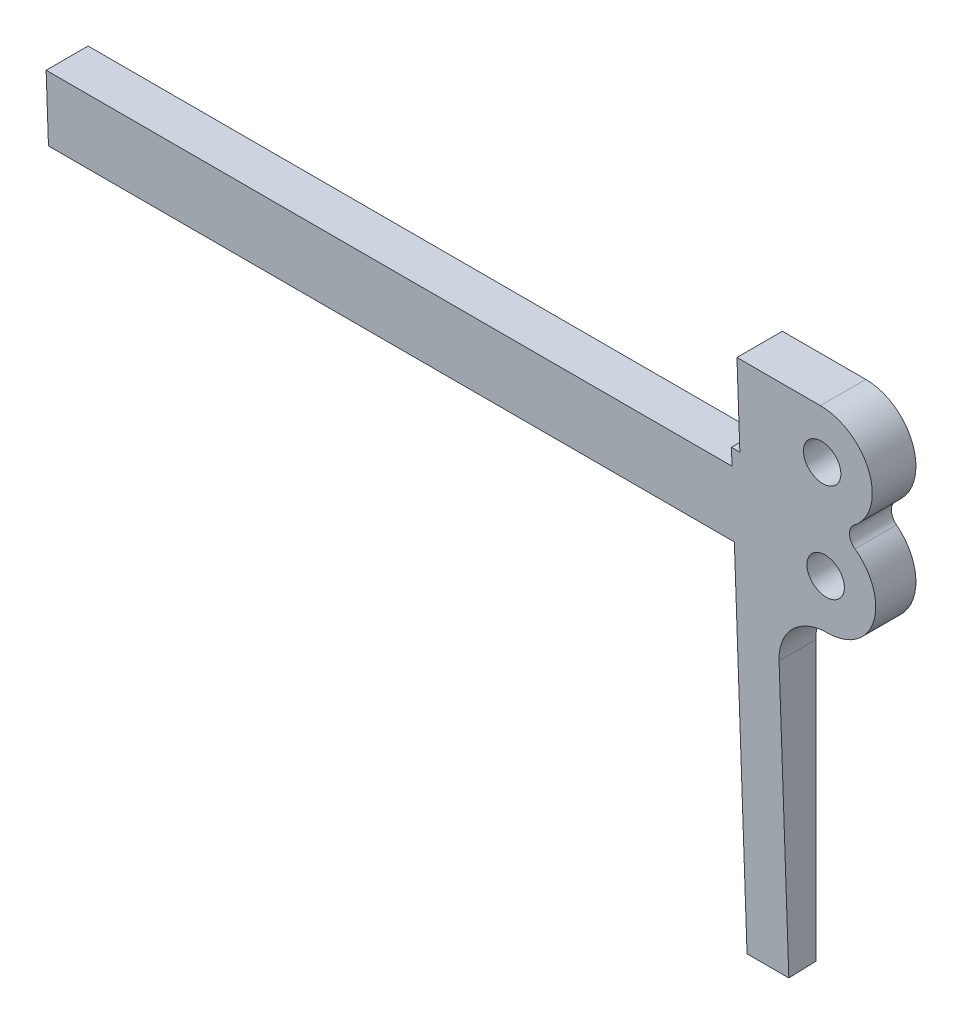
ISO-10303-21;
HEADER;
FILE_DESCRIPTION(('STEP AP214'),'2;1');
FILE_NAME('part.step','',(''),(''),'','','');
FILE_SCHEMA(('AUTOMOTIVE_DESIGN { 1 0 10303 214 1 1 1 1 }'));
ENDSEC;
DATA;
#1=APPLICATION_CONTEXT('core data for automotive mechanical design processes');
#2=APPLICATION_PROTOCOL_DEFINITION('international standard','automotive_design',2000,#1);
#3=PRODUCT_CONTEXT('',#1,'mechanical');
#4=PRODUCT('Part','Part','',(#3));
#5=PRODUCT_RELATED_PRODUCT_CATEGORY('part','',(#4));
#6=PRODUCT_DEFINITION_FORMATION('','',#4);
#7=PRODUCT_DEFINITION_CONTEXT('part definition',#1,'design');
#8=PRODUCT_DEFINITION('design','',#6,#7);
#9=PRODUCT_DEFINITION_SHAPE('','',#8);
#10=(LENGTH_UNIT() NAMED_UNIT(*) SI_UNIT(.MILLI.,.METRE.));
#11=(NAMED_UNIT(*) PLANE_ANGLE_UNIT() SI_UNIT($,.RADIAN.));
#12=(NAMED_UNIT(*) SI_UNIT($,.STERADIAN.) SOLID_ANGLE_UNIT());
#13=UNCERTAINTY_MEASURE_WITH_UNIT(LENGTH_MEASURE(1.E-05),#10,'distance_accuracy_value','');
#14=(GEOMETRIC_REPRESENTATION_CONTEXT(3) GLOBAL_UNCERTAINTY_ASSIGNED_CONTEXT((#13)) GLOBAL_UNIT_ASSIGNED_CONTEXT((#10,
#11,#12)) REPRESENTATION_CONTEXT('',''));
#15=CARTESIAN_POINT('',(0.,0.,0.));
#16=DIRECTION('',(0.,0.,1.));
#17=DIRECTION('',(1.,0.,0.));
#18=AXIS2_PLACEMENT_3D('',#15,#16,#17);
#19=CARTESIAN_POINT('',(-7.95019999999749,0.,76.2));
#20=DIRECTION('',(1.,0.,0.));
#21=DIRECTION('',(0.,0.,-1.));
#22=AXIS2_PLACEMENT_3D('',#19,#20,#21);
#23=PLANE('',#22);
#24=DIRECTION('',(0.,-1.,0.));
#25=VECTOR('',#24,1.);
#26=CARTESIAN_POINT('',(-7.95019999999749,0.,0.));
#27=LINE('',#26,#25);
#28=CARTESIAN_POINT('',(-7.95019999999749,147.6502,0.));
#29=VERTEX_POINT('',#28);
#30=CARTESIAN_POINT('',(-7.95019999999749,78.7664171628417,0.));
#31=VERTEX_POINT('',#30);
#32=EDGE_CURVE('E148',#29,#31,#27,.T.);
#33=ORIENTED_EDGE('',*,*,#32,.T.);
#34=DIRECTION('',(0.,-0.0348994967025044,0.999390827019096));
#35=VECTOR('',#34,1.);
#36=CARTESIAN_POINT('',(-7.95019999999749,76.012759996479,78.8544240702688));
#37=LINE('',#36,#35);
#38=CARTESIAN_POINT('',(-7.95019999999749,78.5876000000001,5.12065356646412));
#39=VERTEX_POINT('',#38);
#40=EDGE_CURVE('E135',#31,#39,#37,.T.);
#41=ORIENTED_EDGE('',*,*,#40,.T.);
#42=DIRECTION('',(0.,0.999390827019096,0.0348994967025044));
#43=VECTOR('',#42,1.);
#44=CARTESIAN_POINT('',(-7.95019999999749,2.57484000352105,2.46622949619527));
#45=LINE('',#44,#43);
#46=CARTESIAN_POINT('',(-7.95019999999749,147.6502,7.53237270156513));
#47=VERTEX_POINT('',#46);
#48=EDGE_CURVE('E145',#39,#47,#45,.T.);
#49=ORIENTED_EDGE('',*,*,#48,.T.);
#50=DIRECTION('',(0.,0.,-1.));
#51=VECTOR('',#50,1.);
#52=CARTESIAN_POINT('',(-7.95019999999749,147.6502,76.2));
#53=LINE('',#52,#51);
#54=EDGE_CURVE('E219',#47,#29,#53,.T.);
#55=ORIENTED_EDGE('',*,*,#54,.T.);
#56=EDGE_LOOP('',(#33,#41,#49,#55));
#57=FACE_BOUND('',#56,.T.);
#58=ADVANCED_FACE('F35',(#57),#23,.F.);
#59=CARTESIAN_POINT('',(0.,0.,76.2));
#60=DIRECTION('',(-1.,0.,0.));
#61=DIRECTION('',(0.,0.,1.));
#62=AXIS2_PLACEMENT_3D('',#59,#60,#61);
#63=PLANE('',#62);
#64=DIRECTION('',(0.,-0.999390827019096,-0.0348994967025044));
#65=VECTOR('',#64,1.);
#66=CARTESIAN_POINT('',(0.,2.57484000352105,2.46622949619527));
#67=LINE('',#66,#65);
#68=CARTESIAN_POINT('',(0.,131.7752,6.97800548588361));
#69=VERTEX_POINT('',#68);
#70=CARTESIAN_POINT('',(0.,78.5876000000001,5.12065356646412));
#71=VERTEX_POINT('',#70);
#72=EDGE_CURVE('E182',#69,#71,#67,.T.);
#73=ORIENTED_EDGE('',*,*,#72,.T.);
#74=DIRECTION('',(0.,0.0348994967025044,-0.999390827019096));
#75=VECTOR('',#74,1.);
#76=CARTESIAN_POINT('',(0.,76.012759996479,78.8544240702688));
#77=LINE('',#76,#75);
#78=CARTESIAN_POINT('',(0.,78.7664171628417,0.));
#79=VERTEX_POINT('',#78);
#80=EDGE_CURVE('E50',#71,#79,#77,.T.);
#81=ORIENTED_EDGE('',*,*,#80,.T.);
#82=DIRECTION('',(0.,1.,0.));
#83=VECTOR('',#82,1.);
#84=CARTESIAN_POINT('',(0.,0.,0.));
#85=LINE('',#84,#83);
#86=CARTESIAN_POINT('',(0.,131.7752,0.));
#87=VERTEX_POINT('',#86);
#88=EDGE_CURVE('E184',#79,#87,#85,.T.);
#89=ORIENTED_EDGE('',*,*,#88,.T.);
#90=DIRECTION('',(0.,0.,-1.));
#91=VECTOR('',#90,1.);
#92=CARTESIAN_POINT('',(0.,131.7752,76.2));
#93=LINE('',#92,#91);
#94=EDGE_CURVE('E222',#69,#87,#93,.T.);
#95=ORIENTED_EDGE('',*,*,#94,.F.);
#96=EDGE_LOOP('',(#73,#81,#89,#95));
#97=FACE_BOUND('',#96,.T.);
#98=ADVANCED_FACE('F295',(#97),#63,.F.);
#99=CARTESIAN_POINT('',(9.52500000000251,131.7752,76.2));
#100=DIRECTION('',(0.,0.,-1.));
#101=DIRECTION('',(-1.,0.,0.));
#102=AXIS2_PLACEMENT_3D('',#99,#100,#101);
#103=CYLINDRICAL_SURFACE('',#102,9.525);
#104=CARTESIAN_POINT('',(9.52500000000251,131.7752,6.97800548588359));
#105=DIRECTION('',(0.,0.0348994967025044,-0.999390827019096));
#106=DIRECTION('',(0.,-0.999390827019096,-0.0348994967025044));
#107=AXIS2_PLACEMENT_3D('',#104,#105,#106);
#108=ELLIPSE('',#107,9.53080590944628,9.525);
#109=CARTESIAN_POINT('',(9.52500000000251,141.3002,7.31062581529253));
#110=VERTEX_POINT('',#109);
#111=EDGE_CURVE('E179',#69,#110,#108,.T.);
#112=ORIENTED_EDGE('',*,*,#111,.F.);
#113=ORIENTED_EDGE('',*,*,#94,.T.);
#114=CARTESIAN_POINT('',(9.52500000000251,131.7752,0.));
#115=DIRECTION('',(0.,0.,1.));
#116=DIRECTION('',(1.,0.,0.));
#117=AXIS2_PLACEMENT_3D('',#114,#115,#116);
#118=CIRCLE('',#117,9.525);
#119=CARTESIAN_POINT('',(9.52500000000251,141.3002,0.));
#120=VERTEX_POINT('',#119);
#121=EDGE_CURVE('E186',#120,#87,#118,.T.);
#122=ORIENTED_EDGE('',*,*,#121,.F.);
#123=DIRECTION('',(0.,0.,-1.));
#124=VECTOR('',#123,1.);
#125=CARTESIAN_POINT('',(9.52500000000251,141.3002,76.2));
#126=LINE('',#125,#124);
#127=EDGE_CURVE('E233',#110,#120,#126,.T.);
#128=ORIENTED_EDGE('',*,*,#127,.F.);
#129=EDGE_LOOP('',(#112,#113,#122,#128));
#130=FACE_BOUND('',#129,.T.);
#131=ADVANCED_FACE('F299',(#130),#103,.F.);
#132=CARTESIAN_POINT('',(9.52500000000251,150.8252,76.2));
#133=DIRECTION('',(0.,0.,-1.));
#134=DIRECTION('',(-1.,0.,0.));
#135=AXIS2_PLACEMENT_3D('',#132,#133,#134);
#136=CYLINDRICAL_SURFACE('',#135,9.52500000000001);
#137=CARTESIAN_POINT('',(9.52500000000251,150.8252,0.));
#138=DIRECTION('',(0.,0.,1.));
#139=DIRECTION('',(1.,0.,0.));
#140=AXIS2_PLACEMENT_3D('',#137,#138,#139);
#141=CIRCLE('',#140,9.52500000000001);
#142=CARTESIAN_POINT('',(15.3712965050964,158.344936842106,0.));
#143=VERTEX_POINT('',#142);
#144=EDGE_CURVE('E189',#120,#143,#141,.T.);
#145=ORIENTED_EDGE('',*,*,#144,.T.);
#146=DIRECTION('',(0.,0.,-1.));
#147=VECTOR('',#146,1.);
#148=CARTESIAN_POINT('',(15.3712965050964,158.344936842106,76.2));
#149=LINE('',#148,#147);
#150=CARTESIAN_POINT('',(15.3712965050964,158.344936842106,7.90584114160327));
#151=VERTEX_POINT('',#150);
#152=EDGE_CURVE('E242',#143,#151,#149,.F.);
#153=ORIENTED_EDGE('',*,*,#152,.T.);
#154=CARTESIAN_POINT('',(9.52500000000251,150.8252,7.64324614470145));
#155=DIRECTION('',(0.,0.0348994967025044,-0.999390827019096));
#156=DIRECTION('',(0.,-0.999390827019096,-0.0348994967025044));
#157=AXIS2_PLACEMENT_3D('',#154,#155,#156);
#158=ELLIPSE('',#157,9.53080590944628,9.52500000000001);
#159=EDGE_CURVE('E177',#151,#110,#158,.T.);
#160=ORIENTED_EDGE('',*,*,#159,.T.);
#161=ORIENTED_EDGE('',*,*,#127,.T.);
#162=EDGE_LOOP('',(#145,#153,#160,#161));
#163=FACE_BOUND('',#162,.T.);
#164=ADVANCED_FACE('F255',(#163),#136,.T.);
#165=CARTESIAN_POINT('',(9.52499999999998,169.8752,76.2));
#166=DIRECTION('',(0.,0.,-1.));
#167=DIRECTION('',(-1.,0.,0.));
#168=AXIS2_PLACEMENT_3D('',#165,#166,#167);
#169=CYLINDRICAL_SURFACE('',#168,9.52499999999999);
#170=CARTESIAN_POINT('',(9.52499999999998,169.8752,8.30848680351931));
#171=DIRECTION('',(0.,0.0348994967025044,-0.999390827019096));
#172=DIRECTION('',(0.,-0.999390827019096,-0.0348994967025044));
#173=AXIS2_PLACEMENT_3D('',#170,#171,#172);
#174=ELLIPSE('',#173,9.53080590944627,9.52499999999999);
#175=CARTESIAN_POINT('',(9.52499999999998,179.4002,8.64110713292823));
#176=VERTEX_POINT('',#175);
#177=CARTESIAN_POINT('',(15.3712965050959,162.355463157896,8.04589180661755));
#178=VERTEX_POINT('',#177);
#179=EDGE_CURVE('E174',#176,#178,#174,.T.);
#180=ORIENTED_EDGE('',*,*,#179,.T.);
#181=DIRECTION('',(0.,0.,-1.));
#182=VECTOR('',#181,1.);
#183=CARTESIAN_POINT('',(15.3712965050959,162.355463157896,76.2));
#184=LINE('',#183,#182);
#185=CARTESIAN_POINT('',(15.3712965050959,162.355463157896,0.));
#186=VERTEX_POINT('',#185);
#187=EDGE_CURVE('E221',#178,#186,#184,.T.);
#188=ORIENTED_EDGE('',*,*,#187,.T.);
#189=CARTESIAN_POINT('',(9.52499999999998,169.8752,0.));
#190=DIRECTION('',(0.,0.,1.));
#191=DIRECTION('',(1.,0.,0.));
#192=AXIS2_PLACEMENT_3D('',#189,#190,#191);
#193=CIRCLE('',#192,9.52499999999999);
#194=CARTESIAN_POINT('',(9.52499999999998,179.4002,0.));
#195=VERTEX_POINT('',#194);
#196=EDGE_CURVE('E192',#186,#195,#193,.T.);
#197=ORIENTED_EDGE('',*,*,#196,.T.);
#198=DIRECTION('',(0.,0.,-1.));
#199=VECTOR('',#198,1.);
#200=CARTESIAN_POINT('',(9.52499999999998,179.4002,76.2));
#201=LINE('',#200,#199);
#202=EDGE_CURVE('E230',#176,#195,#201,.T.);
#203=ORIENTED_EDGE('',*,*,#202,.F.);
#204=EDGE_LOOP('',(#180,#188,#197,#203));
#205=FACE_BOUND('',#204,.T.);
#206=ADVANCED_FACE('F262',(#205),#169,.T.);
#207=CARTESIAN_POINT('',(0.,179.4002,76.2));
#208=DIRECTION('',(0.,-1.,0.));
#209=DIRECTION('',(0.,0.,-1.));
#210=AXIS2_PLACEMENT_3D('',#207,#208,#209);
#211=PLANE('',#210);
#212=DIRECTION('',(0.,0.,-1.));
#213=VECTOR('',#212,1.);
#214=CARTESIAN_POINT('',(-6.35000000000002,179.4002,76.2));
#215=LINE('',#214,#213);
#216=CARTESIAN_POINT('',(-6.35000000000002,179.4002,8.64110713292823));
#217=VERTEX_POINT('',#216);
#218=CARTESIAN_POINT('',(-6.35000000000002,179.4002,0.));
#219=VERTEX_POINT('',#218);
#220=EDGE_CURVE('E228',#217,#219,#215,.T.);
#221=ORIENTED_EDGE('',*,*,#220,.F.);
#222=DIRECTION('',(-1.,0.,0.));
#223=VECTOR('',#222,1.);
#224=CARTESIAN_POINT('',(19.0500000000025,179.4002,8.64110713292823));
#225=LINE('',#224,#223);
#226=EDGE_CURVE('E239',#176,#217,#225,.T.);
#227=ORIENTED_EDGE('',*,*,#226,.F.);
#228=ORIENTED_EDGE('',*,*,#202,.T.);
#229=DIRECTION('',(-1.,0.,0.));
#230=VECTOR('',#229,1.);
#231=CARTESIAN_POINT('',(0.,179.4002,0.));
#232=LINE('',#231,#230);
#233=EDGE_CURVE('E194',#195,#219,#232,.T.);
#234=ORIENTED_EDGE('',*,*,#233,.T.);
#235=EDGE_LOOP('',(#221,#227,#228,#234));
#236=FACE_BOUND('',#235,.T.);
#237=ADVANCED_FACE('F265',(#236),#211,.F.);
#238=CARTESIAN_POINT('',(-6.35000000000002,0.,76.2));
#239=DIRECTION('',(1.,0.,0.));
#240=DIRECTION('',(0.,0.,-1.));
#241=AXIS2_PLACEMENT_3D('',#238,#239,#240);
#242=PLANE('',#241);
#243=DIRECTION('',(0.,0.,-1.));
#244=VECTOR('',#243,1.);
#245=CARTESIAN_POINT('',(-6.35000000000002,163.5252,76.2));
#246=LINE('',#245,#244);
#247=CARTESIAN_POINT('',(-6.35000000000002,163.5252,8.08673991724669));
#248=VERTEX_POINT('',#247);
#249=CARTESIAN_POINT('',(-6.35000000000002,163.5252,0.));
#250=VERTEX_POINT('',#249);
#251=EDGE_CURVE('E226',#248,#250,#246,.T.);
#252=ORIENTED_EDGE('',*,*,#251,.F.);
#253=DIRECTION('',(0.,0.999390827019096,0.0348994967025044));
#254=VECTOR('',#253,1.);
#255=CARTESIAN_POINT('',(-6.35000000000002,2.57484000352105,2.46622949619527));
#256=LINE('',#255,#254);
#257=EDGE_CURVE('E171',#248,#217,#256,.T.);
#258=ORIENTED_EDGE('',*,*,#257,.T.);
#259=ORIENTED_EDGE('',*,*,#220,.T.);
#260=DIRECTION('',(0.,-1.,0.));
#261=VECTOR('',#260,1.);
#262=CARTESIAN_POINT('',(-6.35000000000002,0.,0.));
#263=LINE('',#262,#261);
#264=EDGE_CURVE('E197',#219,#250,#263,.T.);
#265=ORIENTED_EDGE('',*,*,#264,.T.);
#266=EDGE_LOOP('',(#252,#258,#259,#265));
#267=FACE_BOUND('',#266,.T.);
#268=ADVANCED_FACE('F271',(#267),#242,.F.);
#269=CARTESIAN_POINT('',(0.,163.5252,76.2));
#270=DIRECTION('',(0.,-1.,0.));
#271=DIRECTION('',(0.,0.,-1.));
#272=AXIS2_PLACEMENT_3D('',#269,#270,#271);
#273=PLANE('',#272);
#274=DIRECTION('',(0.,0.,-1.));
#275=VECTOR('',#274,1.);
#276=CARTESIAN_POINT('',(-7.95020000000002,163.5252,76.2));
#277=LINE('',#276,#275);
#278=CARTESIAN_POINT('',(-7.95020000000002,163.5252,8.08673991724668));
#279=VERTEX_POINT('',#278);
#280=CARTESIAN_POINT('',(-7.95020000000002,163.5252,0.));
#281=VERTEX_POINT('',#280);
#282=EDGE_CURVE('E224',#279,#281,#277,.T.);
#283=ORIENTED_EDGE('',*,*,#282,.F.);
#284=DIRECTION('',(1.,0.,0.));
#285=VECTOR('',#284,1.);
#286=CARTESIAN_POINT('',(0.,163.5252,8.08673991724669));
#287=LINE('',#286,#285);
#288=EDGE_CURVE('E168',#279,#248,#287,.T.);
#289=ORIENTED_EDGE('',*,*,#288,.T.);
#290=ORIENTED_EDGE('',*,*,#251,.T.);
#291=DIRECTION('',(-1.,0.,0.));
#292=VECTOR('',#291,1.);
#293=CARTESIAN_POINT('',(0.,163.5252,0.));
#294=LINE('',#293,#292);
#295=EDGE_CURVE('E200',#250,#281,#294,.T.);
#296=ORIENTED_EDGE('',*,*,#295,.T.);
#297=EDGE_LOOP('',(#283,#289,#290,#296));
#298=FACE_BOUND('',#297,.T.);
#299=ADVANCED_FACE('F275',(#298),#273,.F.);
#300=CARTESIAN_POINT('',(-7.95020000000002,0.,76.2));
#301=DIRECTION('',(1.,0.,0.));
#302=DIRECTION('',(0.,0.,-1.));
#303=AXIS2_PLACEMENT_3D('',#300,#301,#302);
#304=PLANE('',#303);
#305=DIRECTION('',(0.,0.,-1.));
#306=VECTOR('',#305,1.);
#307=CARTESIAN_POINT('',(-7.95020000000002,160.3502,76.2));
#308=LINE('',#307,#306);
#309=CARTESIAN_POINT('',(-7.95020000000002,160.3502,7.97586647411037));
#310=VERTEX_POINT('',#309);
#311=CARTESIAN_POINT('',(-7.95020000000002,160.3502,0.));
#312=VERTEX_POINT('',#311);
#313=EDGE_CURVE('E218',#310,#312,#308,.T.);
#314=ORIENTED_EDGE('',*,*,#313,.F.);
#315=DIRECTION('',(0.,0.999390827019096,0.0348994967025044));
#316=VECTOR('',#315,1.);
#317=CARTESIAN_POINT('',(-7.95020000000002,2.57484000352105,2.46622949619527));
#318=LINE('',#317,#316);
#319=EDGE_CURVE('E165',#310,#279,#318,.T.);
#320=ORIENTED_EDGE('',*,*,#319,.T.);
#321=ORIENTED_EDGE('',*,*,#282,.T.);
#322=DIRECTION('',(0.,-1.,0.));
#323=VECTOR('',#322,1.);
#324=CARTESIAN_POINT('',(-7.95020000000002,0.,0.));
#325=LINE('',#324,#323);
#326=EDGE_CURVE('E203',#281,#312,#325,.T.);
#327=ORIENTED_EDGE('',*,*,#326,.T.);
#328=EDGE_LOOP('',(#314,#320,#321,#327));
#329=FACE_BOUND('',#328,.T.);
#330=ADVANCED_FACE('F278',(#329),#304,.F.);
#331=CARTESIAN_POINT('',(0.,160.3502,76.2));
#332=DIRECTION('',(0.,-1.,0.));
#333=DIRECTION('',(0.,0.,-1.));
#334=AXIS2_PLACEMENT_3D('',#331,#332,#333);
#335=PLANE('',#334);
#336=DIRECTION('',(-1.,0.,0.));
#337=VECTOR('',#336,1.);
#338=CARTESIAN_POINT('',(0.,160.3502,0.));
#339=LINE('',#338,#337);
#340=CARTESIAN_POINT('',(-138.423649999999,160.3502,0.));
#341=VERTEX_POINT('',#340);
#342=EDGE_CURVE('E206',#312,#341,#339,.T.);
#343=ORIENTED_EDGE('',*,*,#342,.T.);
#344=DIRECTION('',(0.,0.,1.));
#345=VECTOR('',#344,1.);
#346=CARTESIAN_POINT('',(-138.423649999999,160.3502,76.2));
#347=LINE('',#346,#345);
#348=CARTESIAN_POINT('',(-138.423649999999,160.3502,7.97586647411038));
#349=VERTEX_POINT('',#348);
#350=EDGE_CURVE('E284',#341,#349,#347,.T.);
#351=ORIENTED_EDGE('',*,*,#350,.T.);
#352=DIRECTION('',(1.,0.,0.));
#353=VECTOR('',#352,1.);
#354=CARTESIAN_POINT('',(0.,160.3502,7.97586647411037));
#355=LINE('',#354,#353);
#356=EDGE_CURVE('E158',#349,#310,#355,.T.);
#357=ORIENTED_EDGE('',*,*,#356,.T.);
#358=ORIENTED_EDGE('',*,*,#313,.T.);
#359=EDGE_LOOP('',(#343,#351,#357,#358));
#360=FACE_BOUND('',#359,.T.);
#361=ADVANCED_FACE('F283',(#360),#335,.F.);
#362=CARTESIAN_POINT('',(9.52500000000251,150.8252,76.2));
#363=DIRECTION('',(0.,0.,-1.));
#364=DIRECTION('',(-1.,0.,0.));
#365=AXIS2_PLACEMENT_3D('',#362,#363,#364);
#366=CYLINDRICAL_SURFACE('',#365,3.556);
#367=CARTESIAN_POINT('',(9.52500000000251,150.8252,7.64324614470145));
#368=DIRECTION('',(0.,0.0348994967025044,-0.999390827019096));
#369=DIRECTION('',(0.,-0.999390827019096,-0.0348994967025044));
#370=AXIS2_PLACEMENT_3D('',#367,#368,#369);
#371=ELLIPSE('',#370,3.55816753952661,3.556);
#372=CARTESIAN_POINT('',(9.52500000000251,147.2692,7.51906788838878));
#373=VERTEX_POINT('',#372);
#374=EDGE_CURVE('E155',#373,#373,#371,.T.);
#375=ORIENTED_EDGE('',*,*,#374,.F.);
#376=EDGE_LOOP('',(#375));
#377=FACE_BOUND('',#376,.T.);
#378=CARTESIAN_POINT('',(9.52500000000251,150.8252,0.));
#379=DIRECTION('',(0.,0.,1.));
#380=DIRECTION('',(1.,0.,0.));
#381=AXIS2_PLACEMENT_3D('',#378,#379,#380);
#382=CIRCLE('',#381,3.556);
#383=CARTESIAN_POINT('',(13.0810000000025,150.8252,0.));
#384=VERTEX_POINT('',#383);
#385=EDGE_CURVE('E212',#384,#384,#382,.T.);
#386=ORIENTED_EDGE('',*,*,#385,.F.);
#387=EDGE_LOOP('',(#386));
#388=FACE_BOUND('',#387,.T.);
#389=ADVANCED_FACE('F317',(#377,#388),#366,.F.);
#390=CARTESIAN_POINT('',(0.,147.6502,76.2));
#391=DIRECTION('',(0.,1.,0.));
#392=DIRECTION('',(0.,0.,1.));
#393=AXIS2_PLACEMENT_3D('',#390,#391,#392);
#394=PLANE('',#393);
#395=DIRECTION('',(-1.,0.,0.));
#396=VECTOR('',#395,1.);
#397=CARTESIAN_POINT('',(0.,147.6502,7.53237270156513));
#398=LINE('',#397,#396);
#399=CARTESIAN_POINT('',(-138.423649999999,147.6502,7.53237270156513));
#400=VERTEX_POINT('',#399);
#401=EDGE_CURVE('E153',#47,#400,#398,.T.);
#402=ORIENTED_EDGE('',*,*,#401,.T.);
#403=DIRECTION('',(0.,0.,-1.));
#404=VECTOR('',#403,1.);
#405=CARTESIAN_POINT('',(-138.423649999999,147.6502,76.2));
#406=LINE('',#405,#404);
#407=CARTESIAN_POINT('',(-138.423649999999,147.6502,0.));
#408=VERTEX_POINT('',#407);
#409=EDGE_CURVE('E58',#400,#408,#406,.T.);
#410=ORIENTED_EDGE('',*,*,#409,.T.);
#411=DIRECTION('',(1.,0.,0.));
#412=VECTOR('',#411,1.);
#413=CARTESIAN_POINT('',(0.,147.6502,0.));
#414=LINE('',#413,#412);
#415=EDGE_CURVE('E210',#408,#29,#414,.T.);
#416=ORIENTED_EDGE('',*,*,#415,.T.);
#417=ORIENTED_EDGE('',*,*,#54,.F.);
#418=EDGE_LOOP('',(#402,#410,#416,#417));
#419=FACE_BOUND('',#418,.T.);
#420=ADVANCED_FACE('F313',(#419),#394,.F.);
#421=CARTESIAN_POINT('',(9.52499999999998,169.8752,76.2));
#422=DIRECTION('',(0.,0.,-1.));
#423=DIRECTION('',(-1.,0.,0.));
#424=AXIS2_PLACEMENT_3D('',#421,#422,#423);
#425=CYLINDRICAL_SURFACE('',#424,3.556);
#426=CARTESIAN_POINT('',(9.52499999999998,169.8752,8.30848680351931));
#427=DIRECTION('',(0.,0.0348994967025044,-0.999390827019096));
#428=DIRECTION('',(0.,-0.999390827019096,-0.0348994967025044));
#429=AXIS2_PLACEMENT_3D('',#426,#427,#428);
#430=ELLIPSE('',#429,3.55816753952661,3.556);
#431=CARTESIAN_POINT('',(9.52499999999998,166.3192,8.18430854720664));
#432=VERTEX_POINT('',#431);
#433=EDGE_CURVE('E160',#432,#432,#430,.T.);
#434=ORIENTED_EDGE('',*,*,#433,.F.);
#435=EDGE_LOOP('',(#434));
#436=FACE_BOUND('',#435,.T.);
#437=CARTESIAN_POINT('',(9.52499999999998,169.8752,0.));
#438=DIRECTION('',(0.,0.,1.));
#439=DIRECTION('',(1.,0.,0.));
#440=AXIS2_PLACEMENT_3D('',#437,#438,#439);
#441=CIRCLE('',#440,3.556);
#442=CARTESIAN_POINT('',(13.081,169.8752,0.));
#443=VERTEX_POINT('',#442);
#444=EDGE_CURVE('E215',#443,#443,#441,.T.);
#445=ORIENTED_EDGE('',*,*,#444,.F.);
#446=EDGE_LOOP('',(#445));
#447=FACE_BOUND('',#446,.T.);
#448=ADVANCED_FACE('F365',(#436,#447),#425,.F.);
#449=CARTESIAN_POINT('',(0.,0.,0.));
#450=DIRECTION('',(0.,0.,1.));
#451=DIRECTION('',(1.,0.,0.));
#452=AXIS2_PLACEMENT_3D('',#449,#450,#451);
#453=PLANE('',#452);
#454=ORIENTED_EDGE('',*,*,#88,.F.);
#455=DIRECTION('',(-1.,0.,0.));
#456=VECTOR('',#455,1.);
#457=CARTESIAN_POINT('',(0.,78.7664171628417,0.));
#458=LINE('',#457,#456);
#459=EDGE_CURVE('E140',#79,#31,#458,.T.);
#460=ORIENTED_EDGE('',*,*,#459,.T.);
#461=ORIENTED_EDGE('',*,*,#32,.F.);
#462=ORIENTED_EDGE('',*,*,#415,.F.);
#463=DIRECTION('',(0.,1.,0.));
#464=VECTOR('',#463,1.);
#465=CARTESIAN_POINT('',(-138.423649999999,0.,0.));
#466=LINE('',#465,#464);
#467=EDGE_CURVE('E287',#408,#341,#466,.T.);
#468=ORIENTED_EDGE('',*,*,#467,.T.);
#469=ORIENTED_EDGE('',*,*,#342,.F.);
#470=ORIENTED_EDGE('',*,*,#326,.F.);
#471=ORIENTED_EDGE('',*,*,#295,.F.);
#472=ORIENTED_EDGE('',*,*,#264,.F.);
#473=ORIENTED_EDGE('',*,*,#233,.F.);
#474=ORIENTED_EDGE('',*,*,#196,.F.);
#475=CARTESIAN_POINT('',(16.9303089064548,160.350200000001,0.));
#476=DIRECTION('',(0.,0.,1.));
#477=DIRECTION('',(1.,0.,0.));
#478=AXIS2_PLACEMENT_3D('',#475,#476,#477);
#479=CIRCLE('',#478,2.54);
#480=EDGE_CURVE('E43',#186,#143,#479,.T.);
#481=ORIENTED_EDGE('',*,*,#480,.T.);
#482=ORIENTED_EDGE('',*,*,#144,.F.);
#483=ORIENTED_EDGE('',*,*,#121,.T.);
#484=EDGE_LOOP('',(#454,#460,#461,#462,#468,#469,#470,#471,#472,#473,#474,#481,#482,#483));
#485=FACE_BOUND('',#484,.T.);
#486=ORIENTED_EDGE('',*,*,#385,.T.);
#487=EDGE_LOOP('',(#486));
#488=FACE_BOUND('',#487,.T.);
#489=ORIENTED_EDGE('',*,*,#444,.T.);
#490=EDGE_LOOP('',(#489));
#491=FACE_BOUND('',#490,.T.);
#492=ADVANCED_FACE('F247',(#485,#488,#491),#453,.F.);
#493=CARTESIAN_POINT('',(19.0500000000025,-22.225,1.6002));
#494=DIRECTION('',(0.,0.0348994967025044,-0.999390827019096));
#495=DIRECTION('',(0.,0.999390827019096,0.0348994967025044));
#496=AXIS2_PLACEMENT_3D('',#493,#494,#495);
#497=PLANE('',#496);
#498=ORIENTED_EDGE('',*,*,#374,.T.);
#499=EDGE_LOOP('',(#498));
#500=FACE_BOUND('',#499,.T.);
#501=ORIENTED_EDGE('',*,*,#433,.T.);
#502=EDGE_LOOP('',(#501));
#503=FACE_BOUND('',#502,.T.);
#504=ORIENTED_EDGE('',*,*,#48,.F.);
#505=DIRECTION('',(-1.,0.,0.));
#506=VECTOR('',#505,1.);
#507=CARTESIAN_POINT('',(-138.423649999999,78.5876000000001,5.12065356646412));
#508=LINE('',#507,#506);
#509=EDGE_CURVE('E132',#71,#39,#508,.T.);
#510=ORIENTED_EDGE('',*,*,#509,.F.);
#511=ORIENTED_EDGE('',*,*,#72,.F.);
#512=ORIENTED_EDGE('',*,*,#111,.T.);
#513=ORIENTED_EDGE('',*,*,#159,.F.);
#514=CARTESIAN_POINT('',(16.9303089064548,160.350200000001,7.9758664741104));
#515=DIRECTION('',(0.,0.0348994967025044,-0.999390827019096));
#516=DIRECTION('',(0.,0.999390827019096,0.0348994967025044));
#517=AXIS2_PLACEMENT_3D('',#514,#515,#516);
#518=ELLIPSE('',#517,2.54154824251901,2.54);
#519=EDGE_CURVE('E11',#151,#178,#518,.T.);
#520=ORIENTED_EDGE('',*,*,#519,.T.);
#521=ORIENTED_EDGE('',*,*,#179,.F.);
#522=ORIENTED_EDGE('',*,*,#226,.T.);
#523=ORIENTED_EDGE('',*,*,#257,.F.);
#524=ORIENTED_EDGE('',*,*,#288,.F.);
#525=ORIENTED_EDGE('',*,*,#319,.F.);
#526=ORIENTED_EDGE('',*,*,#356,.F.);
#527=DIRECTION('',(0.,0.999390827019096,0.0348994967025044));
#528=VECTOR('',#527,1.);
#529=CARTESIAN_POINT('',(-138.423649999999,-42.9005162307363,0.878195063583495));
#530=LINE('',#529,#528);
#531=EDGE_CURVE('E149',#400,#349,#530,.T.);
#532=ORIENTED_EDGE('',*,*,#531,.F.);
#533=ORIENTED_EDGE('',*,*,#401,.F.);
#534=EDGE_LOOP('',(#504,#510,#511,#512,#513,#520,#521,#522,#523,#524,#525,#526,#532,#533));
#535=FACE_BOUND('',#534,.T.);
#536=ADVANCED_FACE('F151',(#500,#503,#535),#497,.F.);
#537=CARTESIAN_POINT('',(16.9303089064548,160.350200000001,76.2));
#538=DIRECTION('',(0.,0.,1.));
#539=DIRECTION('',(1.,0.,0.));
#540=AXIS2_PLACEMENT_3D('',#537,#538,#539);
#541=CYLINDRICAL_SURFACE('',#540,2.54);
#542=ORIENTED_EDGE('',*,*,#519,.F.);
#543=ORIENTED_EDGE('',*,*,#152,.F.);
#544=ORIENTED_EDGE('',*,*,#480,.F.);
#545=ORIENTED_EDGE('',*,*,#187,.F.);
#546=EDGE_LOOP('',(#542,#543,#544,#545));
#547=FACE_BOUND('',#546,.T.);
#548=ADVANCED_FACE('F37',(#547),#541,.F.);
#549=CARTESIAN_POINT('',(-138.423649999999,-42.5991296493172,-7.7523874180071));
#550=DIRECTION('',(1.,0.,0.));
#551=DIRECTION('',(0.,0.,-1.));
#552=AXIS2_PLACEMENT_3D('',#549,#550,#551);
#553=PLANE('',#552);
#554=ORIENTED_EDGE('',*,*,#467,.F.);
#555=ORIENTED_EDGE('',*,*,#409,.F.);
#556=ORIENTED_EDGE('',*,*,#531,.T.);
#557=ORIENTED_EDGE('',*,*,#350,.F.);
#558=EDGE_LOOP('',(#554,#555,#556,#557));
#559=FACE_BOUND('',#558,.T.);
#560=ADVANCED_FACE('F393',(#559),#553,.F.);
#561=CARTESIAN_POINT('',(-138.423649999999,78.8889865814193,-3.50992891512647));
#562=DIRECTION('',(0.,0.999390827019096,0.0348994967025044));
#563=DIRECTION('',(0.,-0.0348994967025044,0.999390827019096));
#564=AXIS2_PLACEMENT_3D('',#561,#562,#563);
#565=PLANE('',#564);
#566=ORIENTED_EDGE('',*,*,#459,.F.);
#567=ORIENTED_EDGE('',*,*,#80,.F.);
#568=ORIENTED_EDGE('',*,*,#509,.T.);
#569=ORIENTED_EDGE('',*,*,#40,.F.);
#570=EDGE_LOOP('',(#566,#567,#568,#569));
#571=FACE_BOUND('',#570,.T.);
#572=ADVANCED_FACE('F134',(#571),#565,.F.);
#573=CLOSED_SHELL('',(#58,#98,#131,#164,#206,#237,#268,#299,#330,#361,#389,#420,#448,#492,#536,
#548,#560,#572));
#574=MANIFOLD_SOLID_BREP('B2',#573);
#575=ADVANCED_BREP_SHAPE_REPRESENTATION('',(#18,#574),#14);
#576=SHAPE_DEFINITION_REPRESENTATION(#9,#575);
ENDSEC;
END-ISO-10303-21;
